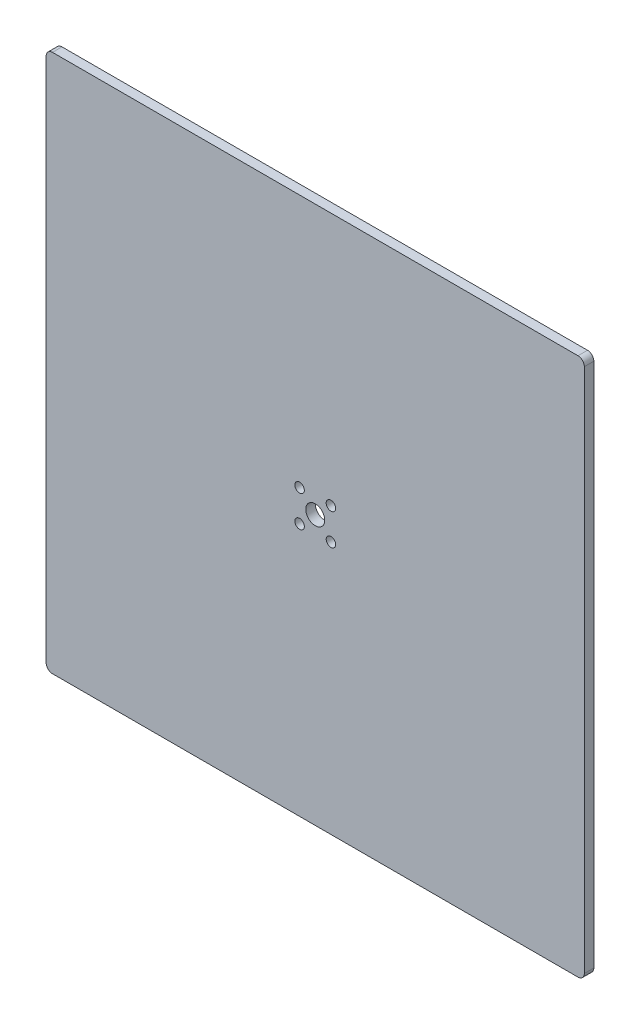
ISO-10303-21;
HEADER;
FILE_DESCRIPTION(('STEP AP214'),'2;1');
FILE_NAME('part.step','',(''),(''),'','','');
FILE_SCHEMA(('AUTOMOTIVE_DESIGN { 1 0 10303 214 1 1 1 1 }'));
ENDSEC;
DATA;
#1=APPLICATION_CONTEXT('core data for automotive mechanical design processes');
#2=APPLICATION_PROTOCOL_DEFINITION('international standard','automotive_design',2000,#1);
#3=PRODUCT_CONTEXT('',#1,'mechanical');
#4=PRODUCT('Part','Part','',(#3));
#5=PRODUCT_RELATED_PRODUCT_CATEGORY('part','',(#4));
#6=PRODUCT_DEFINITION_FORMATION('','',#4);
#7=PRODUCT_DEFINITION_CONTEXT('part definition',#1,'design');
#8=PRODUCT_DEFINITION('design','',#6,#7);
#9=PRODUCT_DEFINITION_SHAPE('','',#8);
#10=(LENGTH_UNIT() NAMED_UNIT(*) SI_UNIT(.MILLI.,.METRE.));
#11=(NAMED_UNIT(*) PLANE_ANGLE_UNIT() SI_UNIT($,.RADIAN.));
#12=(NAMED_UNIT(*) SI_UNIT($,.STERADIAN.) SOLID_ANGLE_UNIT());
#13=UNCERTAINTY_MEASURE_WITH_UNIT(LENGTH_MEASURE(1.E-05),#10,'distance_accuracy_value','');
#14=(GEOMETRIC_REPRESENTATION_CONTEXT(3) GLOBAL_UNCERTAINTY_ASSIGNED_CONTEXT((#13)) GLOBAL_UNIT_ASSIGNED_CONTEXT((#10,
#11,#12)) REPRESENTATION_CONTEXT('',''));
#15=CARTESIAN_POINT('',(0.,0.,0.));
#16=DIRECTION('',(0.,0.,1.));
#17=DIRECTION('',(1.,0.,0.));
#18=AXIS2_PLACEMENT_3D('',#15,#16,#17);
#19=CARTESIAN_POINT('',(-85.,-85.,3.));
#20=DIRECTION('',(1.,0.,0.));
#21=DIRECTION('',(0.,0.,-1.));
#22=AXIS2_PLACEMENT_3D('',#19,#20,#21);
#23=PLANE('',#22);
#24=DIRECTION('',(0.,-1.,0.));
#25=VECTOR('',#24,1.);
#26=CARTESIAN_POINT('',(-85.,-85.,0.));
#27=LINE('',#26,#25);
#28=CARTESIAN_POINT('',(-85.,83.,0.));
#29=VERTEX_POINT('',#28);
#30=CARTESIAN_POINT('',(-85.,-83.,0.));
#31=VERTEX_POINT('',#30);
#32=EDGE_CURVE('E144',#29,#31,#27,.T.);
#33=ORIENTED_EDGE('',*,*,#32,.T.);
#34=DIRECTION('',(0.,0.,-1.));
#35=VECTOR('',#34,1.);
#36=CARTESIAN_POINT('',(-85.,-83.,3.));
#37=LINE('',#36,#35);
#38=CARTESIAN_POINT('',(-85.,-83.,3.));
#39=VERTEX_POINT('',#38);
#40=EDGE_CURVE('E11',#31,#39,#37,.F.);
#41=ORIENTED_EDGE('',*,*,#40,.T.);
#42=DIRECTION('',(0.,-1.,0.));
#43=VECTOR('',#42,1.);
#44=CARTESIAN_POINT('',(-85.,-85.,3.));
#45=LINE('',#44,#43);
#46=CARTESIAN_POINT('',(-85.,83.,3.));
#47=VERTEX_POINT('',#46);
#48=EDGE_CURVE('E142',#47,#39,#45,.T.);
#49=ORIENTED_EDGE('',*,*,#48,.F.);
#50=DIRECTION('',(0.,0.,-1.));
#51=VECTOR('',#50,1.);
#52=CARTESIAN_POINT('',(-85.,83.,3.));
#53=LINE('',#52,#51);
#54=EDGE_CURVE('E51',#47,#29,#53,.T.);
#55=ORIENTED_EDGE('',*,*,#54,.T.);
#56=EDGE_LOOP('',(#33,#41,#49,#55));
#57=FACE_BOUND('',#56,.T.);
#58=ADVANCED_FACE('F42',(#57),#23,.F.);
#59=CARTESIAN_POINT('',(85.,-85.,3.));
#60=DIRECTION('',(0.,1.,0.));
#61=DIRECTION('',(-1.,0.,0.));
#62=AXIS2_PLACEMENT_3D('',#59,#60,#61);
#63=PLANE('',#62);
#64=DIRECTION('',(1.,0.,0.));
#65=VECTOR('',#64,1.);
#66=CARTESIAN_POINT('',(85.,-85.,0.));
#67=LINE('',#66,#65);
#68=CARTESIAN_POINT('',(-83.,-85.,0.));
#69=VERTEX_POINT('',#68);
#70=CARTESIAN_POINT('',(83.,-85.,0.));
#71=VERTEX_POINT('',#70);
#72=EDGE_CURVE('E138',#69,#71,#67,.T.);
#73=ORIENTED_EDGE('',*,*,#72,.T.);
#74=DIRECTION('',(0.,0.,-1.));
#75=VECTOR('',#74,1.);
#76=CARTESIAN_POINT('',(83.,-85.,3.));
#77=LINE('',#76,#75);
#78=CARTESIAN_POINT('',(83.,-85.,3.));
#79=VERTEX_POINT('',#78);
#80=EDGE_CURVE('E114',#71,#79,#77,.F.);
#81=ORIENTED_EDGE('',*,*,#80,.T.);
#82=DIRECTION('',(1.,0.,0.));
#83=VECTOR('',#82,1.);
#84=CARTESIAN_POINT('',(85.,-85.,3.));
#85=LINE('',#84,#83);
#86=CARTESIAN_POINT('',(-83.,-85.,3.));
#87=VERTEX_POINT('',#86);
#88=EDGE_CURVE('E201',#87,#79,#85,.T.);
#89=ORIENTED_EDGE('',*,*,#88,.F.);
#90=DIRECTION('',(0.,0.,-1.));
#91=VECTOR('',#90,1.);
#92=CARTESIAN_POINT('',(-83.,-85.,3.));
#93=LINE('',#92,#91);
#94=EDGE_CURVE('E120',#87,#69,#93,.T.);
#95=ORIENTED_EDGE('',*,*,#94,.T.);
#96=EDGE_LOOP('',(#73,#81,#89,#95));
#97=FACE_BOUND('',#96,.T.);
#98=ADVANCED_FACE('F266',(#97),#63,.F.);
#99=CARTESIAN_POINT('',(85.,-85.,3.));
#100=DIRECTION('',(-1.,0.,0.));
#101=DIRECTION('',(0.,0.,1.));
#102=AXIS2_PLACEMENT_3D('',#99,#100,#101);
#103=PLANE('',#102);
#104=DIRECTION('',(0.,1.,0.));
#105=VECTOR('',#104,1.);
#106=CARTESIAN_POINT('',(85.,-85.,3.));
#107=LINE('',#106,#105);
#108=CARTESIAN_POINT('',(85.,-83.,3.));
#109=VERTEX_POINT('',#108);
#110=CARTESIAN_POINT('',(85.,83.,3.));
#111=VERTEX_POINT('',#110);
#112=EDGE_CURVE('E129',#109,#111,#107,.T.);
#113=ORIENTED_EDGE('',*,*,#112,.F.);
#114=DIRECTION('',(0.,0.,-1.));
#115=VECTOR('',#114,1.);
#116=CARTESIAN_POINT('',(85.,-83.,3.));
#117=LINE('',#116,#115);
#118=CARTESIAN_POINT('',(85.,-83.,0.));
#119=VERTEX_POINT('',#118);
#120=EDGE_CURVE('E113',#109,#119,#117,.T.);
#121=ORIENTED_EDGE('',*,*,#120,.T.);
#122=DIRECTION('',(0.,1.,0.));
#123=VECTOR('',#122,1.);
#124=CARTESIAN_POINT('',(85.,-85.,0.));
#125=LINE('',#124,#123);
#126=CARTESIAN_POINT('',(85.,83.,0.));
#127=VERTEX_POINT('',#126);
#128=EDGE_CURVE('E127',#119,#127,#125,.T.);
#129=ORIENTED_EDGE('',*,*,#128,.T.);
#130=DIRECTION('',(0.,0.,-1.));
#131=VECTOR('',#130,1.);
#132=CARTESIAN_POINT('',(85.,83.,3.));
#133=LINE('',#132,#131);
#134=EDGE_CURVE('E132',#127,#111,#133,.F.);
#135=ORIENTED_EDGE('',*,*,#134,.T.);
#136=EDGE_LOOP('',(#113,#121,#129,#135));
#137=FACE_BOUND('',#136,.T.);
#138=ADVANCED_FACE('F126',(#137),#103,.F.);
#139=CARTESIAN_POINT('',(85.,85.,3.));
#140=DIRECTION('',(0.,-1.,0.));
#141=DIRECTION('',(1.,0.,0.));
#142=AXIS2_PLACEMENT_3D('',#139,#140,#141);
#143=PLANE('',#142);
#144=DIRECTION('',(-1.,0.,0.));
#145=VECTOR('',#144,1.);
#146=CARTESIAN_POINT('',(85.,85.,3.));
#147=LINE('',#146,#145);
#148=CARTESIAN_POINT('',(83.,85.,3.));
#149=VERTEX_POINT('',#148);
#150=CARTESIAN_POINT('',(-83.,85.,3.));
#151=VERTEX_POINT('',#150);
#152=EDGE_CURVE('E149',#149,#151,#147,.T.);
#153=ORIENTED_EDGE('',*,*,#152,.F.);
#154=DIRECTION('',(0.,0.,-1.));
#155=VECTOR('',#154,1.);
#156=CARTESIAN_POINT('',(83.,85.,3.));
#157=LINE('',#156,#155);
#158=CARTESIAN_POINT('',(83.,85.,0.));
#159=VERTEX_POINT('',#158);
#160=EDGE_CURVE('E176',#149,#159,#157,.T.);
#161=ORIENTED_EDGE('',*,*,#160,.T.);
#162=DIRECTION('',(-1.,0.,0.));
#163=VECTOR('',#162,1.);
#164=CARTESIAN_POINT('',(85.,85.,0.));
#165=LINE('',#164,#163);
#166=CARTESIAN_POINT('',(-83.,85.,0.));
#167=VERTEX_POINT('',#166);
#168=EDGE_CURVE('E137',#159,#167,#165,.T.);
#169=ORIENTED_EDGE('',*,*,#168,.T.);
#170=DIRECTION('',(0.,0.,-1.));
#171=VECTOR('',#170,1.);
#172=CARTESIAN_POINT('',(-83.,85.,3.));
#173=LINE('',#172,#171);
#174=EDGE_CURVE('E58',#167,#151,#173,.F.);
#175=ORIENTED_EDGE('',*,*,#174,.T.);
#176=EDGE_LOOP('',(#153,#161,#169,#175));
#177=FACE_BOUND('',#176,.T.);
#178=ADVANCED_FACE('F291',(#177),#143,.F.);
#179=CARTESIAN_POINT('',(0.,0.,3.));
#180=DIRECTION('',(0.,0.,1.));
#181=DIRECTION('',(1.,0.,0.));
#182=AXIS2_PLACEMENT_3D('',#179,#180,#181);
#183=PLANE('',#182);
#184=CARTESIAN_POINT('',(-4.95,-4.95,3.));
#185=DIRECTION('',(0.,0.,-1.));
#186=DIRECTION('',(-1.,0.,0.));
#187=AXIS2_PLACEMENT_3D('',#184,#185,#186);
#188=CIRCLE('',#187,1.5);
#189=CARTESIAN_POINT('',(-6.45,-4.95,3.));
#190=VERTEX_POINT('',#189);
#191=EDGE_CURVE('E211',#190,#190,#188,.T.);
#192=ORIENTED_EDGE('',*,*,#191,.T.);
#193=EDGE_LOOP('',(#192));
#194=FACE_BOUND('',#193,.T.);
#195=CARTESIAN_POINT('',(4.95,-4.95,3.));
#196=DIRECTION('',(0.,0.,-1.));
#197=DIRECTION('',(-1.,0.,0.));
#198=AXIS2_PLACEMENT_3D('',#195,#196,#197);
#199=CIRCLE('',#198,1.5);
#200=CARTESIAN_POINT('',(3.45,-4.95,3.));
#201=VERTEX_POINT('',#200);
#202=EDGE_CURVE('E219',#201,#201,#199,.T.);
#203=ORIENTED_EDGE('',*,*,#202,.T.);
#204=EDGE_LOOP('',(#203));
#205=FACE_BOUND('',#204,.T.);
#206=CARTESIAN_POINT('',(4.95,4.95,3.));
#207=DIRECTION('',(0.,0.,-1.));
#208=DIRECTION('',(-1.,0.,0.));
#209=AXIS2_PLACEMENT_3D('',#206,#207,#208);
#210=CIRCLE('',#209,1.5);
#211=CARTESIAN_POINT('',(3.45,4.95,3.));
#212=VERTEX_POINT('',#211);
#213=EDGE_CURVE('E227',#212,#212,#210,.T.);
#214=ORIENTED_EDGE('',*,*,#213,.T.);
#215=EDGE_LOOP('',(#214));
#216=FACE_BOUND('',#215,.T.);
#217=CARTESIAN_POINT('',(-4.95,4.95,3.));
#218=DIRECTION('',(0.,0.,-1.));
#219=DIRECTION('',(-1.,0.,0.));
#220=AXIS2_PLACEMENT_3D('',#217,#218,#219);
#221=CIRCLE('',#220,1.5);
#222=CARTESIAN_POINT('',(-6.45,4.95,3.));
#223=VERTEX_POINT('',#222);
#224=EDGE_CURVE('E235',#223,#223,#221,.T.);
#225=ORIENTED_EDGE('',*,*,#224,.T.);
#226=EDGE_LOOP('',(#225));
#227=FACE_BOUND('',#226,.T.);
#228=CARTESIAN_POINT('',(0.,0.,3.));
#229=DIRECTION('',(0.,0.,-1.));
#230=DIRECTION('',(-1.,0.,0.));
#231=AXIS2_PLACEMENT_3D('',#228,#229,#230);
#232=CIRCLE('',#231,3.);
#233=CARTESIAN_POINT('',(-3.,0.,3.));
#234=VERTEX_POINT('',#233);
#235=EDGE_CURVE('E191',#234,#234,#232,.T.);
#236=ORIENTED_EDGE('',*,*,#235,.T.);
#237=EDGE_LOOP('',(#236));
#238=FACE_BOUND('',#237,.T.);
#239=ORIENTED_EDGE('',*,*,#88,.T.);
#240=CARTESIAN_POINT('',(83.,-83.,3.));
#241=DIRECTION('',(0.,0.,1.));
#242=DIRECTION('',(1.,0.,0.));
#243=AXIS2_PLACEMENT_3D('',#240,#241,#242);
#244=CIRCLE('',#243,2.);
#245=EDGE_CURVE('E171',#79,#109,#244,.T.);
#246=ORIENTED_EDGE('',*,*,#245,.T.);
#247=ORIENTED_EDGE('',*,*,#112,.T.);
#248=CARTESIAN_POINT('',(83.,83.,3.));
#249=DIRECTION('',(0.,0.,1.));
#250=DIRECTION('',(1.,0.,0.));
#251=AXIS2_PLACEMENT_3D('',#248,#249,#250);
#252=CIRCLE('',#251,2.);
#253=EDGE_CURVE('E65',#111,#149,#252,.T.);
#254=ORIENTED_EDGE('',*,*,#253,.T.);
#255=ORIENTED_EDGE('',*,*,#152,.T.);
#256=CARTESIAN_POINT('',(-83.,83.,3.));
#257=DIRECTION('',(0.,0.,1.));
#258=DIRECTION('',(1.,0.,0.));
#259=AXIS2_PLACEMENT_3D('',#256,#257,#258);
#260=CIRCLE('',#259,2.);
#261=EDGE_CURVE('E163',#151,#47,#260,.T.);
#262=ORIENTED_EDGE('',*,*,#261,.T.);
#263=ORIENTED_EDGE('',*,*,#48,.T.);
#264=CARTESIAN_POINT('',(-83.,-83.,3.));
#265=DIRECTION('',(0.,0.,1.));
#266=DIRECTION('',(1.,0.,0.));
#267=AXIS2_PLACEMENT_3D('',#264,#265,#266);
#268=CIRCLE('',#267,2.);
#269=EDGE_CURVE('E166',#39,#87,#268,.T.);
#270=ORIENTED_EDGE('',*,*,#269,.T.);
#271=EDGE_LOOP('',(#239,#246,#247,#254,#255,#262,#263,#270));
#272=FACE_BOUND('',#271,.T.);
#273=ADVANCED_FACE('F248',(#194,#205,#216,#227,#238,#272),#183,.T.);
#274=CARTESIAN_POINT('',(0.,0.,0.));
#275=DIRECTION('',(0.,0.,1.));
#276=DIRECTION('',(1.,0.,0.));
#277=AXIS2_PLACEMENT_3D('',#274,#275,#276);
#278=PLANE('',#277);
#279=CARTESIAN_POINT('',(-4.95,-4.95,0.));
#280=DIRECTION('',(0.,0.,-1.));
#281=DIRECTION('',(-1.,0.,0.));
#282=AXIS2_PLACEMENT_3D('',#279,#280,#281);
#283=CIRCLE('',#282,1.5);
#284=CARTESIAN_POINT('',(-6.45,-4.95,0.));
#285=VERTEX_POINT('',#284);
#286=EDGE_CURVE('E215',#285,#285,#283,.T.);
#287=ORIENTED_EDGE('',*,*,#286,.F.);
#288=EDGE_LOOP('',(#287));
#289=FACE_BOUND('',#288,.T.);
#290=CARTESIAN_POINT('',(4.95,-4.95,0.));
#291=DIRECTION('',(0.,0.,-1.));
#292=DIRECTION('',(-1.,0.,0.));
#293=AXIS2_PLACEMENT_3D('',#290,#291,#292);
#294=CIRCLE('',#293,1.5);
#295=CARTESIAN_POINT('',(3.45,-4.95,0.));
#296=VERTEX_POINT('',#295);
#297=EDGE_CURVE('E223',#296,#296,#294,.T.);
#298=ORIENTED_EDGE('',*,*,#297,.F.);
#299=EDGE_LOOP('',(#298));
#300=FACE_BOUND('',#299,.T.);
#301=CARTESIAN_POINT('',(4.95,4.95,0.));
#302=DIRECTION('',(0.,0.,-1.));
#303=DIRECTION('',(-1.,0.,0.));
#304=AXIS2_PLACEMENT_3D('',#301,#302,#303);
#305=CIRCLE('',#304,1.5);
#306=CARTESIAN_POINT('',(3.45,4.95,0.));
#307=VERTEX_POINT('',#306);
#308=EDGE_CURVE('E231',#307,#307,#305,.T.);
#309=ORIENTED_EDGE('',*,*,#308,.F.);
#310=EDGE_LOOP('',(#309));
#311=FACE_BOUND('',#310,.T.);
#312=CARTESIAN_POINT('',(-4.95,4.95,0.));
#313=DIRECTION('',(0.,0.,-1.));
#314=DIRECTION('',(-1.,0.,0.));
#315=AXIS2_PLACEMENT_3D('',#312,#313,#314);
#316=CIRCLE('',#315,1.5);
#317=CARTESIAN_POINT('',(-6.45,4.95,0.));
#318=VERTEX_POINT('',#317);
#319=EDGE_CURVE('E209',#318,#318,#316,.T.);
#320=ORIENTED_EDGE('',*,*,#319,.F.);
#321=EDGE_LOOP('',(#320));
#322=FACE_BOUND('',#321,.T.);
#323=CARTESIAN_POINT('',(0.,0.,0.));
#324=DIRECTION('',(0.,0.,-1.));
#325=DIRECTION('',(-1.,0.,0.));
#326=AXIS2_PLACEMENT_3D('',#323,#324,#325);
#327=CIRCLE('',#326,3.);
#328=CARTESIAN_POINT('',(-3.,0.,0.));
#329=VERTEX_POINT('',#328);
#330=EDGE_CURVE('E194',#329,#329,#327,.T.);
#331=ORIENTED_EDGE('',*,*,#330,.F.);
#332=EDGE_LOOP('',(#331));
#333=FACE_BOUND('',#332,.T.);
#334=ORIENTED_EDGE('',*,*,#128,.F.);
#335=CARTESIAN_POINT('',(83.,-83.,0.));
#336=DIRECTION('',(0.,0.,1.));
#337=DIRECTION('',(1.,0.,0.));
#338=AXIS2_PLACEMENT_3D('',#335,#336,#337);
#339=CIRCLE('',#338,2.);
#340=EDGE_CURVE('E109',#119,#71,#339,.F.);
#341=ORIENTED_EDGE('',*,*,#340,.T.);
#342=ORIENTED_EDGE('',*,*,#72,.F.);
#343=CARTESIAN_POINT('',(-83.,-83.,0.));
#344=DIRECTION('',(0.,0.,1.));
#345=DIRECTION('',(1.,0.,0.));
#346=AXIS2_PLACEMENT_3D('',#343,#344,#345);
#347=CIRCLE('',#346,2.);
#348=EDGE_CURVE('E153',#69,#31,#347,.F.);
#349=ORIENTED_EDGE('',*,*,#348,.T.);
#350=ORIENTED_EDGE('',*,*,#32,.F.);
#351=CARTESIAN_POINT('',(-83.,83.,0.));
#352=DIRECTION('',(0.,0.,1.));
#353=DIRECTION('',(1.,0.,0.));
#354=AXIS2_PLACEMENT_3D('',#351,#352,#353);
#355=CIRCLE('',#354,2.);
#356=EDGE_CURVE('E131',#29,#167,#355,.F.);
#357=ORIENTED_EDGE('',*,*,#356,.T.);
#358=ORIENTED_EDGE('',*,*,#168,.F.);
#359=CARTESIAN_POINT('',(83.,83.,0.));
#360=DIRECTION('',(0.,0.,1.));
#361=DIRECTION('',(1.,0.,0.));
#362=AXIS2_PLACEMENT_3D('',#359,#360,#361);
#363=CIRCLE('',#362,2.);
#364=EDGE_CURVE('E121',#159,#127,#363,.F.);
#365=ORIENTED_EDGE('',*,*,#364,.T.);
#366=EDGE_LOOP('',(#334,#341,#342,#349,#350,#357,#358,#365));
#367=FACE_BOUND('',#366,.T.);
#368=ADVANCED_FACE('F134',(#289,#300,#311,#322,#333,#367),#278,.F.);
#369=CARTESIAN_POINT('',(0.,0.,3.));
#370=DIRECTION('',(0.,0.,-1.));
#371=DIRECTION('',(-1.,0.,0.));
#372=AXIS2_PLACEMENT_3D('',#369,#370,#371);
#373=CYLINDRICAL_SURFACE('',#372,3.);
#374=ORIENTED_EDGE('',*,*,#235,.F.);
#375=EDGE_LOOP('',(#374));
#376=FACE_BOUND('',#375,.T.);
#377=ORIENTED_EDGE('',*,*,#330,.T.);
#378=EDGE_LOOP('',(#377));
#379=FACE_BOUND('',#378,.T.);
#380=ADVANCED_FACE('F247',(#376,#379),#373,.F.);
#381=CARTESIAN_POINT('',(-4.95,4.95,3.));
#382=DIRECTION('',(0.,0.,-1.));
#383=DIRECTION('',(-1.,0.,0.));
#384=AXIS2_PLACEMENT_3D('',#381,#382,#383);
#385=CYLINDRICAL_SURFACE('',#384,1.5);
#386=ORIENTED_EDGE('',*,*,#224,.F.);
#387=EDGE_LOOP('',(#386));
#388=FACE_BOUND('',#387,.T.);
#389=ORIENTED_EDGE('',*,*,#319,.T.);
#390=EDGE_LOOP('',(#389));
#391=FACE_BOUND('',#390,.T.);
#392=ADVANCED_FACE('F243',(#388,#391),#385,.F.);
#393=CARTESIAN_POINT('',(4.95,4.95,3.));
#394=DIRECTION('',(0.,0.,-1.));
#395=DIRECTION('',(-1.,0.,0.));
#396=AXIS2_PLACEMENT_3D('',#393,#394,#395);
#397=CYLINDRICAL_SURFACE('',#396,1.5);
#398=ORIENTED_EDGE('',*,*,#213,.F.);
#399=EDGE_LOOP('',(#398));
#400=FACE_BOUND('',#399,.T.);
#401=ORIENTED_EDGE('',*,*,#308,.T.);
#402=EDGE_LOOP('',(#401));
#403=FACE_BOUND('',#402,.T.);
#404=ADVANCED_FACE('F259',(#400,#403),#397,.F.);
#405=CARTESIAN_POINT('',(4.95,-4.95,3.));
#406=DIRECTION('',(0.,0.,-1.));
#407=DIRECTION('',(-1.,0.,0.));
#408=AXIS2_PLACEMENT_3D('',#405,#406,#407);
#409=CYLINDRICAL_SURFACE('',#408,1.5);
#410=ORIENTED_EDGE('',*,*,#202,.F.);
#411=EDGE_LOOP('',(#410));
#412=FACE_BOUND('',#411,.T.);
#413=ORIENTED_EDGE('',*,*,#297,.T.);
#414=EDGE_LOOP('',(#413));
#415=FACE_BOUND('',#414,.T.);
#416=ADVANCED_FACE('F320',(#412,#415),#409,.F.);
#417=CARTESIAN_POINT('',(-4.95,-4.95,3.));
#418=DIRECTION('',(0.,0.,-1.));
#419=DIRECTION('',(-1.,0.,0.));
#420=AXIS2_PLACEMENT_3D('',#417,#418,#419);
#421=CYLINDRICAL_SURFACE('',#420,1.5);
#422=ORIENTED_EDGE('',*,*,#191,.F.);
#423=EDGE_LOOP('',(#422));
#424=FACE_BOUND('',#423,.T.);
#425=ORIENTED_EDGE('',*,*,#286,.T.);
#426=EDGE_LOOP('',(#425));
#427=FACE_BOUND('',#426,.T.);
#428=ADVANCED_FACE('F278',(#424,#427),#421,.F.);
#429=CARTESIAN_POINT('',(83.,-83.,3.));
#430=DIRECTION('',(0.,0.,-1.));
#431=DIRECTION('',(-1.,0.,0.));
#432=AXIS2_PLACEMENT_3D('',#429,#430,#431);
#433=CYLINDRICAL_SURFACE('',#432,2.);
#434=ORIENTED_EDGE('',*,*,#245,.F.);
#435=ORIENTED_EDGE('',*,*,#80,.F.);
#436=ORIENTED_EDGE('',*,*,#340,.F.);
#437=ORIENTED_EDGE('',*,*,#120,.F.);
#438=EDGE_LOOP('',(#434,#435,#436,#437));
#439=FACE_BOUND('',#438,.T.);
#440=ADVANCED_FACE('F112',(#439),#433,.T.);
#441=CARTESIAN_POINT('',(83.,83.,3.));
#442=DIRECTION('',(0.,0.,-1.));
#443=DIRECTION('',(-1.,0.,0.));
#444=AXIS2_PLACEMENT_3D('',#441,#442,#443);
#445=CYLINDRICAL_SURFACE('',#444,2.);
#446=ORIENTED_EDGE('',*,*,#253,.F.);
#447=ORIENTED_EDGE('',*,*,#134,.F.);
#448=ORIENTED_EDGE('',*,*,#364,.F.);
#449=ORIENTED_EDGE('',*,*,#160,.F.);
#450=EDGE_LOOP('',(#446,#447,#448,#449));
#451=FACE_BOUND('',#450,.T.);
#452=ADVANCED_FACE('F277',(#451),#445,.T.);
#453=CARTESIAN_POINT('',(-83.,-83.,3.));
#454=DIRECTION('',(0.,0.,-1.));
#455=DIRECTION('',(-1.,0.,0.));
#456=AXIS2_PLACEMENT_3D('',#453,#454,#455);
#457=CYLINDRICAL_SURFACE('',#456,2.);
#458=ORIENTED_EDGE('',*,*,#269,.F.);
#459=ORIENTED_EDGE('',*,*,#40,.F.);
#460=ORIENTED_EDGE('',*,*,#348,.F.);
#461=ORIENTED_EDGE('',*,*,#94,.F.);
#462=EDGE_LOOP('',(#458,#459,#460,#461));
#463=FACE_BOUND('',#462,.T.);
#464=ADVANCED_FACE('F280',(#463),#457,.T.);
#465=CARTESIAN_POINT('',(-83.,83.,3.));
#466=DIRECTION('',(0.,0.,-1.));
#467=DIRECTION('',(-1.,0.,0.));
#468=AXIS2_PLACEMENT_3D('',#465,#466,#467);
#469=CYLINDRICAL_SURFACE('',#468,2.);
#470=ORIENTED_EDGE('',*,*,#261,.F.);
#471=ORIENTED_EDGE('',*,*,#174,.F.);
#472=ORIENTED_EDGE('',*,*,#356,.F.);
#473=ORIENTED_EDGE('',*,*,#54,.F.);
#474=EDGE_LOOP('',(#470,#471,#472,#473));
#475=FACE_BOUND('',#474,.T.);
#476=ADVANCED_FACE('F44',(#475),#469,.T.);
#477=CLOSED_SHELL('',(#58,#98,#138,#178,#273,#368,#380,#392,#404,#416,#428,#440,#452,#464,#476));
#478=MANIFOLD_SOLID_BREP('B2',#477);
#479=ADVANCED_BREP_SHAPE_REPRESENTATION('',(#18,#478),#14);
#480=SHAPE_DEFINITION_REPRESENTATION(#9,#479);
ENDSEC;
END-ISO-10303-21;
